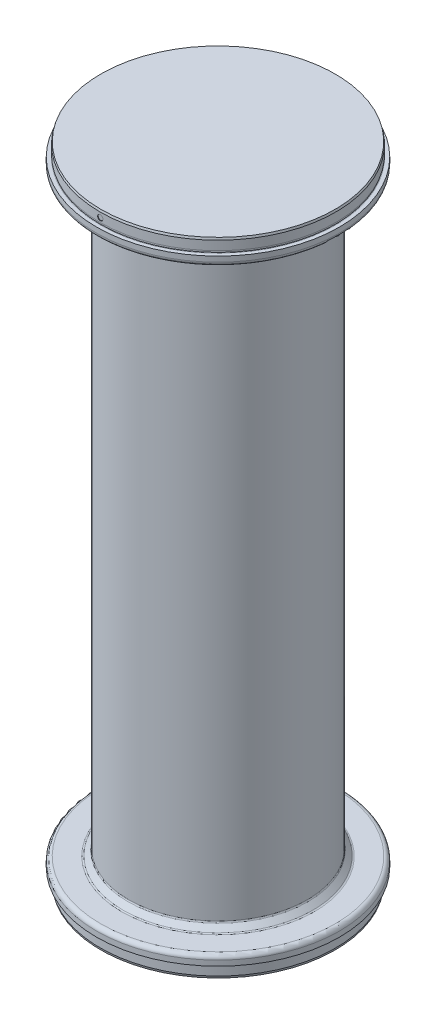
ISO-10303-21;
HEADER;
FILE_DESCRIPTION(('STEP AP214'),'2;1');
FILE_NAME('part.step','',(''),(''),'','','');
FILE_SCHEMA(('AUTOMOTIVE_DESIGN { 1 0 10303 214 1 1 1 1 }'));
ENDSEC;
DATA;
#1=APPLICATION_CONTEXT('core data for automotive mechanical design processes');
#2=APPLICATION_PROTOCOL_DEFINITION('international standard','automotive_design',2000,#1);
#3=PRODUCT_CONTEXT('',#1,'mechanical');
#4=PRODUCT('Part','Part','',(#3));
#5=PRODUCT_RELATED_PRODUCT_CATEGORY('part','',(#4));
#6=PRODUCT_DEFINITION_FORMATION('','',#4);
#7=PRODUCT_DEFINITION_CONTEXT('part definition',#1,'design');
#8=PRODUCT_DEFINITION('design','',#6,#7);
#9=PRODUCT_DEFINITION_SHAPE('','',#8);
#10=(LENGTH_UNIT() NAMED_UNIT(*) SI_UNIT(.MILLI.,.METRE.));
#11=(NAMED_UNIT(*) PLANE_ANGLE_UNIT() SI_UNIT($,.RADIAN.));
#12=(NAMED_UNIT(*) SI_UNIT($,.STERADIAN.) SOLID_ANGLE_UNIT());
#13=UNCERTAINTY_MEASURE_WITH_UNIT(LENGTH_MEASURE(1.E-05),#10,'distance_accuracy_value','');
#14=(GEOMETRIC_REPRESENTATION_CONTEXT(3) GLOBAL_UNCERTAINTY_ASSIGNED_CONTEXT((#13)) GLOBAL_UNIT_ASSIGNED_CONTEXT((#10,
#11,#12)) REPRESENTATION_CONTEXT('',''));
#15=CARTESIAN_POINT('',(0.,0.,0.));
#16=DIRECTION('',(0.,0.,1.));
#17=DIRECTION('',(1.,0.,0.));
#18=AXIS2_PLACEMENT_3D('',#15,#16,#17);
#19=CARTESIAN_POINT('',(0.,-299.2,0.));
#20=DIRECTION('',(0.,1.,0.));
#21=DIRECTION('',(0.,0.,1.));
#22=AXIS2_PLACEMENT_3D('',#19,#20,#21);
#23=TOROIDAL_SURFACE('',#22,56.,0.500000000000001);
#24=CARTESIAN_POINT('',(0.,-299.7,0.));
#25=DIRECTION('',(0.,-1.,0.));
#26=DIRECTION('',(0.,0.,-1.));
#27=AXIS2_PLACEMENT_3D('',#24,#25,#26);
#28=CIRCLE('',#27,56.);
#29=CARTESIAN_POINT('',(0.,-299.7,-56.));
#30=VERTEX_POINT('',#29);
#31=EDGE_CURVE('E399',#30,#30,#28,.T.);
#32=ORIENTED_EDGE('',*,*,#31,.F.);
#33=EDGE_LOOP('',(#32));
#34=FACE_BOUND('',#33,.T.);
#35=CARTESIAN_POINT('',(0.,-299.622141244461,0.));
#36=DIRECTION('',(0.,1.,0.));
#37=DIRECTION('',(0.,0.,1.));
#38=AXIS2_PLACEMENT_3D('',#35,#36,#37);
#39=CIRCLE('',#38,55.7320508075689);
#40=CARTESIAN_POINT('',(0.,-299.622141244461,55.7320508075688));
#41=VERTEX_POINT('',#40);
#42=EDGE_CURVE('E402',#41,#41,#39,.T.);
#43=ORIENTED_EDGE('',*,*,#42,.F.);
#44=EDGE_LOOP('',(#43));
#45=FACE_BOUND('',#44,.T.);
#46=ADVANCED_FACE('F37',(#34,#45),#23,.F.);
#47=CARTESIAN_POINT('',(0.,-5.8,0.));
#48=DIRECTION('',(0.,1.,0.));
#49=DIRECTION('',(0.,0.,1.));
#50=AXIS2_PLACEMENT_3D('',#47,#48,#49);
#51=TOROIDAL_SURFACE('',#50,56.,0.5);
#52=CARTESIAN_POINT('',(0.,-5.37785875553842,0.));
#53=DIRECTION('',(0.,1.,0.));
#54=DIRECTION('',(0.,0.,1.));
#55=AXIS2_PLACEMENT_3D('',#52,#53,#54);
#56=CIRCLE('',#55,55.732050807569);
#57=CARTESIAN_POINT('',(0.,-5.37785875553843,55.732050807569));
#58=VERTEX_POINT('',#57);
#59=EDGE_CURVE('E197',#58,#58,#56,.T.);
#60=ORIENTED_EDGE('',*,*,#59,.T.);
#61=EDGE_LOOP('',(#60));
#62=FACE_BOUND('',#61,.T.);
#63=CARTESIAN_POINT('',(0.,-5.30000000000003,0.));
#64=DIRECTION('',(0.,1.,0.));
#65=DIRECTION('',(0.,0.,1.));
#66=AXIS2_PLACEMENT_3D('',#63,#64,#65);
#67=CIRCLE('',#66,56.);
#68=CARTESIAN_POINT('',(0.,-5.30000000000003,56.));
#69=VERTEX_POINT('',#68);
#70=EDGE_CURVE('E101',#69,#69,#67,.T.);
#71=ORIENTED_EDGE('',*,*,#70,.F.);
#72=EDGE_LOOP('',(#71));
#73=FACE_BOUND('',#72,.T.);
#74=ADVANCED_FACE('F122',(#62,#73),#51,.F.);
#75=CARTESIAN_POINT('',(0.,-299.7,0.));
#76=DIRECTION('',(0.,1.,0.));
#77=DIRECTION('',(0.,0.,1.));
#78=AXIS2_PLACEMENT_3D('',#75,#76,#77);
#79=CYLINDRICAL_SURFACE('',#78,55.732050807569);
#80=CARTESIAN_POINT('',(0.,-6.22214124446158,0.));
#81=DIRECTION('',(0.,1.,0.));
#82=DIRECTION('',(0.,0.,1.));
#83=AXIS2_PLACEMENT_3D('',#80,#81,#82);
#84=CIRCLE('',#83,55.732050807569);
#85=CARTESIAN_POINT('',(0.,-6.22214124446158,55.732050807569));
#86=VERTEX_POINT('',#85);
#87=EDGE_CURVE('E189',#86,#86,#84,.T.);
#88=ORIENTED_EDGE('',*,*,#87,.T.);
#89=EDGE_LOOP('',(#88));
#90=FACE_BOUND('',#89,.T.);
#91=ORIENTED_EDGE('',*,*,#59,.F.);
#92=EDGE_LOOP('',(#91));
#93=FACE_BOUND('',#92,.T.);
#94=ADVANCED_FACE('F128',(#90,#93),#79,.T.);
#95=CARTESIAN_POINT('',(0.,-5.8,0.));
#96=DIRECTION('',(0.,1.,0.));
#97=DIRECTION('',(0.,0.,1.));
#98=AXIS2_PLACEMENT_3D('',#95,#96,#97);
#99=TOROIDAL_SURFACE('',#98,56.,0.5);
#100=CARTESIAN_POINT('',(0.,-6.29999999999997,0.));
#101=DIRECTION('',(0.,1.,0.));
#102=DIRECTION('',(0.,0.,1.));
#103=AXIS2_PLACEMENT_3D('',#100,#101,#102);
#104=CIRCLE('',#103,56.);
#105=CARTESIAN_POINT('',(0.,-6.29999999999998,56.));
#106=VERTEX_POINT('',#105);
#107=EDGE_CURVE('E185',#106,#106,#104,.T.);
#108=ORIENTED_EDGE('',*,*,#107,.T.);
#109=EDGE_LOOP('',(#108));
#110=FACE_BOUND('',#109,.T.);
#111=ORIENTED_EDGE('',*,*,#87,.F.);
#112=EDGE_LOOP('',(#111));
#113=FACE_BOUND('',#112,.T.);
#114=ADVANCED_FACE('F206',(#110,#113),#99,.F.);
#115=CARTESIAN_POINT('',(56.,-6.3,0.));
#116=DIRECTION('',(0.,1.,0.));
#117=DIRECTION('',(0.,0.,1.));
#118=AXIS2_PLACEMENT_3D('',#115,#116,#117);
#119=PLANE('',#118);
#120=CARTESIAN_POINT('',(0.,-6.30000000000003,0.));
#121=DIRECTION('',(0.,1.,0.));
#122=DIRECTION('',(0.,0.,1.));
#123=AXIS2_PLACEMENT_3D('',#120,#121,#122);
#124=CIRCLE('',#123,57.75);
#125=CARTESIAN_POINT('',(0.,-6.30000000000003,57.75));
#126=VERTEX_POINT('',#125);
#127=EDGE_CURVE('E183',#126,#126,#124,.T.);
#128=ORIENTED_EDGE('',*,*,#127,.T.);
#129=EDGE_LOOP('',(#128));
#130=FACE_BOUND('',#129,.T.);
#131=ORIENTED_EDGE('',*,*,#107,.F.);
#132=EDGE_LOOP('',(#131));
#133=FACE_BOUND('',#132,.T.);
#134=ADVANCED_FACE('F179',(#130,#133),#119,.T.);
#135=CARTESIAN_POINT('',(0.,-299.7,0.));
#136=DIRECTION('',(0.,1.,0.));
#137=DIRECTION('',(0.,0.,1.));
#138=AXIS2_PLACEMENT_3D('',#135,#136,#137);
#139=CYLINDRICAL_SURFACE('',#138,57.75);
#140=CARTESIAN_POINT('',(0.,-8.80000000000003,0.));
#141=DIRECTION('',(0.,-1.,0.));
#142=DIRECTION('',(0.,0.,-1.));
#143=AXIS2_PLACEMENT_3D('',#140,#141,#142);
#144=CIRCLE('',#143,57.75);
#145=CARTESIAN_POINT('',(0.,-8.80000000000002,-57.75));
#146=VERTEX_POINT('',#145);
#147=EDGE_CURVE('E52',#146,#146,#144,.F.);
#148=ORIENTED_EDGE('',*,*,#147,.T.);
#149=EDGE_LOOP('',(#148));
#150=FACE_BOUND('',#149,.T.);
#151=ORIENTED_EDGE('',*,*,#127,.F.);
#152=EDGE_LOOP('',(#151));
#153=FACE_BOUND('',#152,.T.);
#154=ADVANCED_FACE('F175',(#150,#153),#139,.T.);
#155=CARTESIAN_POINT('',(57.75,-10.8,0.));
#156=DIRECTION('',(0.,-1.,0.));
#157=DIRECTION('',(0.,0.,-1.));
#158=AXIS2_PLACEMENT_3D('',#155,#156,#157);
#159=PLANE('',#158);
#160=CARTESIAN_POINT('',(0.,-10.8,0.));
#161=DIRECTION('',(0.,-1.,0.));
#162=DIRECTION('',(0.,0.,-1.));
#163=AXIS2_PLACEMENT_3D('',#160,#161,#162);
#164=CIRCLE('',#163,55.75);
#165=CARTESIAN_POINT('',(0.,-10.8,-55.75));
#166=VERTEX_POINT('',#165);
#167=EDGE_CURVE('E48',#166,#166,#164,.T.);
#168=ORIENTED_EDGE('',*,*,#167,.T.);
#169=EDGE_LOOP('',(#168));
#170=FACE_BOUND('',#169,.T.);
#171=CARTESIAN_POINT('',(0.,-10.8,0.));
#172=DIRECTION('',(0.,-1.,0.));
#173=DIRECTION('',(0.,0.,-1.));
#174=AXIS2_PLACEMENT_3D('',#171,#172,#173);
#175=CIRCLE('',#174,45.8142135623732);
#176=CARTESIAN_POINT('',(0.,-10.8,-45.8142135623732));
#177=VERTEX_POINT('',#176);
#178=EDGE_CURVE('E78',#177,#177,#175,.F.);
#179=ORIENTED_EDGE('',*,*,#178,.T.);
#180=EDGE_LOOP('',(#179));
#181=FACE_BOUND('',#180,.T.);
#182=ADVANCED_FACE('F178',(#170,#181),#159,.T.);
#183=CARTESIAN_POINT('',(0.,-10.8,0.));
#184=DIRECTION('',(0.,1.,0.));
#185=DIRECTION('',(0.,0.,1.));
#186=AXIS2_PLACEMENT_3D('',#183,#184,#185);
#187=CONICAL_SURFACE('',#186,45.4000000000001,0.785398163397455);
#188=CARTESIAN_POINT('',(0.,-11.0928932188134,0.));
#189=DIRECTION('',(0.,1.,0.));
#190=DIRECTION('',(0.,0.,1.));
#191=AXIS2_PLACEMENT_3D('',#188,#189,#190);
#192=CIRCLE('',#191,45.1071067811867);
#193=CARTESIAN_POINT('',(0.,-11.0928932188135,45.1071067811867));
#194=VERTEX_POINT('',#193);
#195=EDGE_CURVE('E72',#194,#194,#192,.F.);
#196=ORIENTED_EDGE('',*,*,#195,.T.);
#197=EDGE_LOOP('',(#196));
#198=FACE_BOUND('',#197,.T.);
#199=CARTESIAN_POINT('',(0.,-13.4071067811866,0.));
#200=DIRECTION('',(0.,1.,0.));
#201=DIRECTION('',(0.,0.,1.));
#202=AXIS2_PLACEMENT_3D('',#199,#200,#201);
#203=CIRCLE('',#202,42.7928932188135);
#204=CARTESIAN_POINT('',(0.,-13.4071067811866,42.7928932188135));
#205=VERTEX_POINT('',#204);
#206=EDGE_CURVE('E75',#205,#205,#203,.T.);
#207=ORIENTED_EDGE('',*,*,#206,.T.);
#208=EDGE_LOOP('',(#207));
#209=FACE_BOUND('',#208,.T.);
#210=ADVANCED_FACE('F218',(#198,#209),#187,.T.);
#211=CARTESIAN_POINT('',(0.,-299.7,0.));
#212=DIRECTION('',(0.,1.,0.));
#213=DIRECTION('',(0.,0.,1.));
#214=AXIS2_PLACEMENT_3D('',#211,#212,#213);
#215=CYLINDRICAL_SURFACE('',#214,42.5);
#216=CARTESIAN_POINT('',(0.,-290.885786437627,0.));
#217=DIRECTION('',(0.,1.,0.));
#218=DIRECTION('',(0.,0.,1.));
#219=AXIS2_PLACEMENT_3D('',#216,#217,#218);
#220=CIRCLE('',#219,42.5);
#221=CARTESIAN_POINT('',(0.,-290.885786437627,42.5));
#222=VERTEX_POINT('',#221);
#223=EDGE_CURVE('E57',#222,#222,#220,.T.);
#224=ORIENTED_EDGE('',*,*,#223,.T.);
#225=EDGE_LOOP('',(#224));
#226=FACE_BOUND('',#225,.T.);
#227=CARTESIAN_POINT('',(0.,-14.1142135623732,0.));
#228=DIRECTION('',(0.,1.,0.));
#229=DIRECTION('',(0.,0.,1.));
#230=AXIS2_PLACEMENT_3D('',#227,#228,#229);
#231=CIRCLE('',#230,42.5);
#232=CARTESIAN_POINT('',(0.,-14.1142135623732,42.5));
#233=VERTEX_POINT('',#232);
#234=EDGE_CURVE('E60',#233,#233,#231,.F.);
#235=ORIENTED_EDGE('',*,*,#234,.T.);
#236=EDGE_LOOP('',(#235));
#237=FACE_BOUND('',#236,.T.);
#238=ADVANCED_FACE('F222',(#226,#237),#215,.T.);
#239=CARTESIAN_POINT('',(0.,-291.3,0.));
#240=DIRECTION('',(0.,-1.,0.));
#241=DIRECTION('',(0.,0.,-1.));
#242=AXIS2_PLACEMENT_3D('',#239,#240,#241);
#243=CONICAL_SURFACE('',#242,42.5,0.785398163397442);
#244=CARTESIAN_POINT('',(0.,-293.907106781187,0.));
#245=DIRECTION('',(0.,-1.,0.));
#246=DIRECTION('',(0.,0.,-1.));
#247=AXIS2_PLACEMENT_3D('',#244,#245,#246);
#248=CIRCLE('',#247,45.1071067811867);
#249=CARTESIAN_POINT('',(0.,-293.907106781187,-45.1071067811867));
#250=VERTEX_POINT('',#249);
#251=EDGE_CURVE('E66',#250,#250,#248,.F.);
#252=ORIENTED_EDGE('',*,*,#251,.T.);
#253=EDGE_LOOP('',(#252));
#254=FACE_BOUND('',#253,.T.);
#255=CARTESIAN_POINT('',(0.,-291.592893218813,0.));
#256=DIRECTION('',(0.,-1.,0.));
#257=DIRECTION('',(0.,0.,-1.));
#258=AXIS2_PLACEMENT_3D('',#255,#256,#257);
#259=CIRCLE('',#258,42.7928932188135);
#260=CARTESIAN_POINT('',(0.,-291.592893218813,-42.7928932188135));
#261=VERTEX_POINT('',#260);
#262=EDGE_CURVE('E69',#261,#261,#259,.T.);
#263=ORIENTED_EDGE('',*,*,#262,.T.);
#264=EDGE_LOOP('',(#263));
#265=FACE_BOUND('',#264,.T.);
#266=ADVANCED_FACE('F226',(#254,#265),#243,.T.);
#267=CARTESIAN_POINT('',(45.4000000000001,-294.2,0.));
#268=DIRECTION('',(0.,1.,0.));
#269=DIRECTION('',(0.,0.,1.));
#270=AXIS2_PLACEMENT_3D('',#267,#268,#269);
#271=PLANE('',#270);
#272=CARTESIAN_POINT('',(0.,-294.2,0.));
#273=DIRECTION('',(0.,1.,0.));
#274=DIRECTION('',(0.,0.,1.));
#275=AXIS2_PLACEMENT_3D('',#272,#273,#274);
#276=CIRCLE('',#275,55.75);
#277=CARTESIAN_POINT('',(0.,-294.2,55.75));
#278=VERTEX_POINT('',#277);
#279=EDGE_CURVE('E44',#278,#278,#276,.T.);
#280=ORIENTED_EDGE('',*,*,#279,.T.);
#281=EDGE_LOOP('',(#280));
#282=FACE_BOUND('',#281,.T.);
#283=CARTESIAN_POINT('',(0.,-294.2,0.));
#284=DIRECTION('',(0.,1.,0.));
#285=DIRECTION('',(0.,0.,1.));
#286=AXIS2_PLACEMENT_3D('',#283,#284,#285);
#287=CIRCLE('',#286,45.8142135623732);
#288=CARTESIAN_POINT('',(0.,-294.2,45.8142135623732));
#289=VERTEX_POINT('',#288);
#290=EDGE_CURVE('E63',#289,#289,#287,.F.);
#291=ORIENTED_EDGE('',*,*,#290,.T.);
#292=EDGE_LOOP('',(#291));
#293=FACE_BOUND('',#292,.T.);
#294=ADVANCED_FACE('F230',(#282,#293),#271,.T.);
#295=CARTESIAN_POINT('',(0.,-299.7,0.));
#296=DIRECTION('',(0.,1.,0.));
#297=DIRECTION('',(0.,0.,1.));
#298=AXIS2_PLACEMENT_3D('',#295,#296,#297);
#299=CYLINDRICAL_SURFACE('',#298,57.75);
#300=CARTESIAN_POINT('',(0.,-296.2,0.));
#301=DIRECTION('',(0.,1.,0.));
#302=DIRECTION('',(0.,0.,1.));
#303=AXIS2_PLACEMENT_3D('',#300,#301,#302);
#304=CIRCLE('',#303,57.75);
#305=CARTESIAN_POINT('',(0.,-296.2,57.75));
#306=VERTEX_POINT('',#305);
#307=EDGE_CURVE('E10',#306,#306,#304,.F.);
#308=ORIENTED_EDGE('',*,*,#307,.T.);
#309=EDGE_LOOP('',(#308));
#310=FACE_BOUND('',#309,.T.);
#311=CARTESIAN_POINT('',(0.,-298.7,0.));
#312=DIRECTION('',(0.,1.,0.));
#313=DIRECTION('',(0.,0.,1.));
#314=AXIS2_PLACEMENT_3D('',#311,#312,#313);
#315=CIRCLE('',#314,57.75);
#316=CARTESIAN_POINT('',(0.,-298.7,57.75));
#317=VERTEX_POINT('',#316);
#318=EDGE_CURVE('E186',#317,#317,#315,.T.);
#319=ORIENTED_EDGE('',*,*,#318,.T.);
#320=EDGE_LOOP('',(#319));
#321=FACE_BOUND('',#320,.T.);
#322=ADVANCED_FACE('F234',(#310,#321),#299,.T.);
#323=CARTESIAN_POINT('',(57.75,-298.7,0.));
#324=DIRECTION('',(0.,-1.,0.));
#325=DIRECTION('',(0.,0.,-1.));
#326=AXIS2_PLACEMENT_3D('',#323,#324,#325);
#327=PLANE('',#326);
#328=CARTESIAN_POINT('',(0.,-298.7,0.));
#329=DIRECTION('',(0.,1.,0.));
#330=DIRECTION('',(0.,0.,1.));
#331=AXIS2_PLACEMENT_3D('',#328,#329,#330);
#332=CIRCLE('',#331,56.0000000000001);
#333=CARTESIAN_POINT('',(0.,-298.7,56.));
#334=VERTEX_POINT('',#333);
#335=EDGE_CURVE('E192',#334,#334,#332,.T.);
#336=ORIENTED_EDGE('',*,*,#335,.T.);
#337=EDGE_LOOP('',(#336));
#338=FACE_BOUND('',#337,.T.);
#339=ORIENTED_EDGE('',*,*,#318,.F.);
#340=EDGE_LOOP('',(#339));
#341=FACE_BOUND('',#340,.T.);
#342=ADVANCED_FACE('F237',(#338,#341),#327,.T.);
#343=CARTESIAN_POINT('',(0.,-299.2,0.));
#344=DIRECTION('',(0.,1.,0.));
#345=DIRECTION('',(0.,0.,1.));
#346=AXIS2_PLACEMENT_3D('',#343,#344,#345);
#347=TOROIDAL_SURFACE('',#346,56.,0.500000000000008);
#348=CARTESIAN_POINT('',(0.,-298.777858755538,0.));
#349=DIRECTION('',(0.,1.,0.));
#350=DIRECTION('',(0.,0.,1.));
#351=AXIS2_PLACEMENT_3D('',#348,#349,#350);
#352=CIRCLE('',#351,55.732050807569);
#353=CARTESIAN_POINT('',(0.,-298.777858755538,55.732050807569));
#354=VERTEX_POINT('',#353);
#355=EDGE_CURVE('E407',#354,#354,#352,.T.);
#356=ORIENTED_EDGE('',*,*,#355,.T.);
#357=EDGE_LOOP('',(#356));
#358=FACE_BOUND('',#357,.T.);
#359=ORIENTED_EDGE('',*,*,#335,.F.);
#360=EDGE_LOOP('',(#359));
#361=FACE_BOUND('',#360,.T.);
#362=ADVANCED_FACE('F240',(#358,#361),#347,.F.);
#363=CARTESIAN_POINT('',(0.,-299.7,0.));
#364=DIRECTION('',(0.,1.,0.));
#365=DIRECTION('',(0.,0.,1.));
#366=AXIS2_PLACEMENT_3D('',#363,#364,#365);
#367=CYLINDRICAL_SURFACE('',#366,55.7320508075689);
#368=ORIENTED_EDGE('',*,*,#42,.T.);
#369=EDGE_LOOP('',(#368));
#370=FACE_BOUND('',#369,.T.);
#371=ORIENTED_EDGE('',*,*,#355,.F.);
#372=EDGE_LOOP('',(#371));
#373=FACE_BOUND('',#372,.T.);
#374=ADVANCED_FACE('F244',(#370,#373),#367,.T.);
#375=CARTESIAN_POINT('',(0.,-305.,0.));
#376=DIRECTION('',(0.,1.,0.));
#377=DIRECTION('',(0.,0.,1.));
#378=AXIS2_PLACEMENT_3D('',#375,#376,#377);
#379=CYLINDRICAL_SURFACE('',#378,56.);
#380=CARTESIAN_POINT('',(0.,-304.,0.));
#381=DIRECTION('',(0.,-1.,0.));
#382=DIRECTION('',(0.,0.,-1.));
#383=AXIS2_PLACEMENT_3D('',#380,#381,#382);
#384=CIRCLE('',#383,56.);
#385=CARTESIAN_POINT('',(0.,-304.,-56.));
#386=VERTEX_POINT('',#385);
#387=EDGE_CURVE('E81',#386,#386,#384,.F.);
#388=ORIENTED_EDGE('',*,*,#387,.T.);
#389=EDGE_LOOP('',(#388));
#390=FACE_BOUND('',#389,.T.);
#391=ORIENTED_EDGE('',*,*,#31,.T.);
#392=EDGE_LOOP('',(#391));
#393=FACE_BOUND('',#392,.T.);
#394=ADVANCED_FACE('F248',(#390,#393),#379,.T.);
#395=CARTESIAN_POINT('',(0.,-305.,0.));
#396=DIRECTION('',(0.,-1.,0.));
#397=DIRECTION('',(0.,0.,-1.));
#398=AXIS2_PLACEMENT_3D('',#395,#396,#397);
#399=PLANE('',#398);
#400=CARTESIAN_POINT('',(0.,-305.,0.));
#401=DIRECTION('',(0.,-1.,0.));
#402=DIRECTION('',(0.,0.,-1.));
#403=AXIS2_PLACEMENT_3D('',#400,#401,#402);
#404=CIRCLE('',#403,55.7320508075688);
#405=CARTESIAN_POINT('',(0.,-305.,-55.7320508075689));
#406=VERTEX_POINT('',#405);
#407=EDGE_CURVE('E84',#406,#406,#404,.T.);
#408=ORIENTED_EDGE('',*,*,#407,.T.);
#409=EDGE_LOOP('',(#408));
#410=FACE_BOUND('',#409,.T.);
#411=ADVANCED_FACE('F119',(#410),#399,.T.);
#412=CARTESIAN_POINT('',(0.,0.,0.));
#413=DIRECTION('',(0.,-1.,0.));
#414=DIRECTION('',(0.,0.,-1.));
#415=AXIS2_PLACEMENT_3D('',#412,#413,#414);
#416=CYLINDRICAL_SURFACE('',#415,56.);
#417=CARTESIAN_POINT('',(0.,-0.999999999999393,0.));
#418=DIRECTION('',(0.,1.,0.));
#419=DIRECTION('',(0.,0.,1.));
#420=AXIS2_PLACEMENT_3D('',#417,#418,#419);
#421=CIRCLE('',#420,56.);
#422=CARTESIAN_POINT('',(0.,-0.9999999999994,56.));
#423=VERTEX_POINT('',#422);
#424=EDGE_CURVE('E87',#423,#423,#421,.F.);
#425=ORIENTED_EDGE('',*,*,#424,.T.);
#426=EDGE_LOOP('',(#425));
#427=FACE_BOUND('',#426,.T.);
#428=CARTESIAN_POINT('',(1.24999999999999,-3.30000000000001,55.9860473689651));
#429=CARTESIAN_POINT('',(1.24999688963887,-3.37020366433376,55.9860475574269));
#430=CARTESIAN_POINT('',(1.24406588579105,-3.44045801035116,55.9861808349521));
#431=CARTESIAN_POINT('',(1.22048859883108,-3.57903121734381,55.9866996818331));
#432=CARTESIAN_POINT('',(1.20282827388892,-3.64734765600289,55.9870855535755));
#433=CARTESIAN_POINT('',(1.15629592179564,-3.78001745846903,55.9880658552625));
#434=CARTESIAN_POINT('',(1.12742932161818,-3.84437272314193,55.9886601842421));
#435=CARTESIAN_POINT('',(1.05931147341796,-3.9673057388356,55.9899903019052));
#436=CARTESIAN_POINT('',(1.02006278147823,-4.02588490707149,55.9907260557577));
#437=CARTESIAN_POINT('',(0.932279712771722,-4.13563959972913,55.9922563959625));
#438=CARTESIAN_POINT('',(0.88374292173312,-4.1868131931197,55.9930509975784));
#439=CARTESIAN_POINT('',(0.778765117208697,-4.28028804154015,55.9946093361605));
#440=CARTESIAN_POINT('',(0.722323791053312,-4.32258894543903,55.9953730719042));
#441=CARTESIAN_POINT('',(0.603134414103991,-4.39711871044454,55.9967836201851));
#442=CARTESIAN_POINT('',(0.540385823093325,-4.42934670783438,55.9974304226936));
#443=CARTESIAN_POINT('',(0.410367031989757,-4.48281007935621,55.9985340983977));
#444=CARTESIAN_POINT('',(0.343096845989343,-4.50404548774709,55.9989909721853));
#445=CARTESIAN_POINT('',(0.205956278116038,-4.53491754334805,55.9996632191393));
#446=CARTESIAN_POINT('',(0.136086332371211,-4.54455612704413,55.9998786326254));
#447=CARTESIAN_POINT('',(-0.00428019817757927,-4.55196688366278,56.0000438099505));
#448=CARTESIAN_POINT('',(-0.0747767810927266,-4.549739092341,55.9999935745898));
#449=CARTESIAN_POINT('',(-0.214382307614808,-4.53348200566256,55.9996331525608));
#450=CARTESIAN_POINT('',(-0.283491495872729,-4.51945481004637,55.9993230121433));
#451=CARTESIAN_POINT('',(-0.418373870629961,-4.48000033796205,55.9984777921935));
#452=CARTESIAN_POINT('',(-0.48414705149381,-4.45457304223663,55.9979427122812));
#453=CARTESIAN_POINT('',(-0.610497048247961,-4.39303775479692,55.9967078487871));
#454=CARTESIAN_POINT('',(-0.671073394985831,-4.3569288000851,55.9960080503563));
#455=CARTESIAN_POINT('',(-0.78530500569529,-4.27505593264041,55.9945226295033));
#456=CARTESIAN_POINT('',(-0.838960262158871,-4.22929200943396,55.993737006988));
#457=CARTESIAN_POINT('',(-0.937838865048235,-4.12939638302991,55.9921682885637));
#458=CARTESIAN_POINT('',(-0.983060368707748,-4.07526285579737,55.9913851932436));
#459=CARTESIAN_POINT('',(-1.06377359512674,-3.96017112892419,55.9899099891641));
#460=CARTESIAN_POINT('',(-1.09926531645143,-3.89921292827716,55.9892178804183));
#461=CARTESIAN_POINT('',(-1.15951127105516,-3.77220124361535,55.9880026973751));
#462=CARTESIAN_POINT('',(-1.18426544720393,-3.70614773249263,55.9874796239771));
#463=CARTESIAN_POINT('',(-1.22233244793757,-3.570820930815,55.9866615273536));
#464=CARTESIAN_POINT('',(-1.23564529000736,-3.5015476451808,55.9863665037795));
#465=CARTESIAN_POINT('',(-1.25044945994322,-3.36176375695762,55.9860378327075));
#466=CARTESIAN_POINT('',(-1.25194333888567,-3.29125342467348,55.9860041288047));
#467=CARTESIAN_POINT('',(-1.24307382183089,-3.15098293018022,55.9862017500441));
#468=CARTESIAN_POINT('',(-1.23271043319737,-3.08122276750525,55.9864330750216));
#469=CARTESIAN_POINT('',(-1.20042267482863,-2.94443998080837,55.987134624142));
#470=CARTESIAN_POINT('',(-1.17849946210575,-2.87741708353927,55.987604824376));
#471=CARTESIAN_POINT('',(-1.12371555868563,-2.74800300796554,55.988731095337));
#472=CARTESIAN_POINT('',(-1.09085485642531,-2.68561183455765,55.9893871662605));
#473=CARTESIAN_POINT('',(-1.01512220081122,-2.56722053127835,55.9908113539804));
#474=CARTESIAN_POINT('',(-0.972248528733056,-2.51122150107667,55.9915794900043));
#475=CARTESIAN_POINT('',(-0.877709492109729,-2.40721514266246,55.9931411433267));
#476=CARTESIAN_POINT('',(-0.826044113562378,-2.35920782717824,55.9939346606657));
#477=CARTESIAN_POINT('',(-0.715377352207859,-2.27253917459942,55.9954577828283));
#478=CARTESIAN_POINT('',(-0.65637468041118,-2.23387948318441,55.9961873763835));
#479=CARTESIAN_POINT('',(-0.532714843145242,-2.16701476561392,55.9975002408509));
#480=CARTESIAN_POINT('',(-0.468057687399902,-2.1388097214802,55.9980835120147));
#481=CARTESIAN_POINT('',(-0.334930489956477,-2.09365781051194,55.9990379241533));
#482=CARTESIAN_POINT('',(-0.266460811475537,-2.07670987320059,55.999409085298));
#483=CARTESIAN_POINT('',(-0.127646977541765,-2.05454974947422,55.999897515461));
#484=CARTESIAN_POINT('',(-0.0573028214891539,-2.04933756681434,56.000014784398));
#485=CARTESIAN_POINT('',(0.083246561885148,-2.05079705229693,55.9999822107917));
#486=CARTESIAN_POINT('',(0.153451816259794,-2.05746611797889,55.9998324267434));
#487=CARTESIAN_POINT('',(0.29174601720588,-2.08249345774404,55.9992827433743));
#488=CARTESIAN_POINT('',(0.359834959554001,-2.10085175515273,55.9988828435544));
#489=CARTESIAN_POINT('',(0.491965217638647,-2.14873626858925,55.9978779866512));
#490=CARTESIAN_POINT('',(0.556006461076081,-2.17826268403375,55.9972730259064));
#491=CARTESIAN_POINT('',(0.678221022273066,-2.24764382226418,55.9959262431638));
#492=CARTESIAN_POINT('',(0.736394560240623,-2.28749815725508,55.9951844263051));
#493=CARTESIAN_POINT('',(0.845232994749189,-2.37640931463093,55.9936474020458));
#494=CARTESIAN_POINT('',(0.895897044819055,-2.42546717302912,55.9928521886409));
#495=CARTESIAN_POINT('',(0.988283437599335,-2.53140656597392,55.9912978680228));
#496=CARTESIAN_POINT('',(1.03000355938619,-2.58829003800467,55.9905387698138));
#497=CARTESIAN_POINT('',(1.10332184556612,-2.70828266416014,55.9891420777498));
#498=CARTESIAN_POINT('',(1.13491420869797,-2.7713953594621,55.9885045536178));
#499=CARTESIAN_POINT('',(1.18701800565716,-2.90198130183895,55.9874242472492));
#500=CARTESIAN_POINT('',(1.2075426846034,-2.9694492280357,55.9869812323546));
#501=CARTESIAN_POINT('',(1.23147539161105,-3.08112086765232,55.9864586035693));
#502=CARTESIAN_POINT('',(1.23841341072616,-3.12459938855451,55.9863050580527));
#503=CARTESIAN_POINT('',(1.24767668897286,-3.21204530738187,55.9860993817168));
#504=CARTESIAN_POINT('',(1.25000194884943,-3.25601270522807,55.9860472508811));
#505=CARTESIAN_POINT('',(1.24999999999999,-3.30000000000001,55.9860473689651));
#506=B_SPLINE_CURVE_WITH_KNOTS('',3,(#428,#429,#430,#431,#432,#433,#434,#435,#436,#437,#438,
#439,#440,#441,#442,#443,#444,#445,#446,#447,#448,#449,#450,#451,#452,#453,#454,#455,#456,#457,
#458,#459,#460,#461,#462,#463,#464,#465,#466,#467,#468,#469,#470,#471,#472,#473,#474,#475,#476,
#477,#478,#479,#480,#481,#482,#483,#484,#485,#486,#487,#488,#489,#490,#491,#492,#493,#494,#495,
#496,#497,#498,#499,#500,#501,#502,#503,#504,#505),.UNSPECIFIED.,.T.,.F.,(4,2,2,2,2,2,2,2,2,2,2,
2,2,2,2,2,2,2,2,2,2,2,2,2,2,2,2,2,2,2,2,2,2,2,2,2,2,2,4),(0.,0.210450436251762,
0.421153269781356,0.631754191203126,0.842303310614905,1.05290723294897,1.2635194882266,
1.47414979782285,1.68477945097644,1.89537392743144,2.10596776932556,2.3165241433205,
2.527080872993,2.7376565910491,2.94823253753611,3.15885444088205,3.36947637528683,
3.58009943031443,3.79072216346236,4.00129943328702,4.21187657233709,4.42243263891137,
4.63298892808559,4.84358138580518,5.05417417892968,5.26480402064841,5.47543350015772,
5.68604294732055,5.89665246187317,6.10721585033339,6.31777965896764,6.52834722758315,
6.73890689090576,6.94949027054015,7.16012588105486,7.37088193063779,7.58138519750347,
7.71324650356471,7.84510778833015),.UNSPECIFIED.);
#507=CARTESIAN_POINT('',(1.24999999999999,-3.30000000000001,55.9860473689651));
#508=VERTEX_POINT('',#507);
#509=EDGE_CURVE('E93',#508,#508,#506,.T.);
#510=ORIENTED_EDGE('',*,*,#509,.T.);
#511=EDGE_LOOP('',(#510));
#512=FACE_BOUND('',#511,.T.);
#513=ORIENTED_EDGE('',*,*,#70,.T.);
#514=EDGE_LOOP('',(#513));
#515=FACE_BOUND('',#514,.T.);
#516=ADVANCED_FACE('F103',(#427,#512,#515),#416,.T.);
#517=CARTESIAN_POINT('',(0.,0.,0.));
#518=DIRECTION('',(0.,1.,0.));
#519=DIRECTION('',(0.,0.,1.));
#520=AXIS2_PLACEMENT_3D('',#517,#518,#519);
#521=PLANE('',#520);
#522=CARTESIAN_POINT('',(0.,0.,0.));
#523=DIRECTION('',(0.,1.,0.));
#524=DIRECTION('',(0.,0.,1.));
#525=AXIS2_PLACEMENT_3D('',#522,#523,#524);
#526=CIRCLE('',#525,55.732050807569);
#527=CARTESIAN_POINT('',(0.,0.,55.732050807569));
#528=VERTEX_POINT('',#527);
#529=EDGE_CURVE('E90',#528,#528,#526,.T.);
#530=ORIENTED_EDGE('',*,*,#529,.T.);
#531=EDGE_LOOP('',(#530));
#532=FACE_BOUND('',#531,.T.);
#533=ADVANCED_FACE('F112',(#532),#521,.T.);
#534=CARTESIAN_POINT('',(0.,-3.30000000000001,55.7180310780761));
#535=DIRECTION('',(0.,0.,1.));
#536=DIRECTION('',(1.,0.,0.));
#537=AXIS2_PLACEMENT_3D('',#534,#535,#536);
#538=CYLINDRICAL_SURFACE('',#537,1.24999999999999);
#539=CARTESIAN_POINT('',(0.,-3.30000000000001,55.7180310780761));
#540=DIRECTION('',(0.,0.,1.));
#541=DIRECTION('',(1.,0.,0.));
#542=AXIS2_PLACEMENT_3D('',#539,#540,#541);
#543=CIRCLE('',#542,1.24999999999999);
#544=CARTESIAN_POINT('',(1.24999999999999,-3.30000000000001,55.7180310780761));
#545=VERTEX_POINT('',#544);
#546=EDGE_CURVE('E398',#545,#545,#543,.T.);
#547=ORIENTED_EDGE('',*,*,#546,.F.);
#548=EDGE_LOOP('',(#547));
#549=FACE_BOUND('',#548,.T.);
#550=ORIENTED_EDGE('',*,*,#509,.F.);
#551=EDGE_LOOP('',(#550));
#552=FACE_BOUND('',#551,.T.);
#553=ADVANCED_FACE('F107',(#549,#552),#538,.F.);
#554=CARTESIAN_POINT('',(0.,-4.55,55.7180310780761));
#555=DIRECTION('',(0.,0.,-1.));
#556=DIRECTION('',(-1.,0.,0.));
#557=AXIS2_PLACEMENT_3D('',#554,#555,#556);
#558=PLANE('',#557);
#559=ORIENTED_EDGE('',*,*,#546,.T.);
#560=EDGE_LOOP('',(#559));
#561=FACE_BOUND('',#560,.T.);
#562=ADVANCED_FACE('F111',(#561),#558,.F.);
#563=CARTESIAN_POINT('',(0.,0.,0.));
#564=DIRECTION('',(0.,-1.,0.));
#565=DIRECTION('',(0.,0.,-1.));
#566=AXIS2_PLACEMENT_3D('',#563,#564,#565);
#567=CONICAL_SURFACE('',#566,55.732050807569,0.261799387799166);
#568=ORIENTED_EDGE('',*,*,#424,.F.);
#569=EDGE_LOOP('',(#568));
#570=FACE_BOUND('',#569,.T.);
#571=ORIENTED_EDGE('',*,*,#529,.F.);
#572=EDGE_LOOP('',(#571));
#573=FACE_BOUND('',#572,.T.);
#574=ADVANCED_FACE('F136',(#570,#573),#567,.T.);
#575=CARTESIAN_POINT('',(0.,-305.,0.));
#576=DIRECTION('',(0.,1.,0.));
#577=DIRECTION('',(0.,0.,1.));
#578=AXIS2_PLACEMENT_3D('',#575,#576,#577);
#579=CONICAL_SURFACE('',#578,55.7320508075688,0.261799387799168);
#580=ORIENTED_EDGE('',*,*,#387,.F.);
#581=EDGE_LOOP('',(#580));
#582=FACE_BOUND('',#581,.T.);
#583=ORIENTED_EDGE('',*,*,#407,.F.);
#584=EDGE_LOOP('',(#583));
#585=FACE_BOUND('',#584,.T.);
#586=ADVANCED_FACE('F142',(#582,#585),#579,.T.);
#587=CARTESIAN_POINT('',(0.,-11.8,0.));
#588=DIRECTION('',(0.,-1.,0.));
#589=DIRECTION('',(0.,0.,-1.));
#590=AXIS2_PLACEMENT_3D('',#587,#588,#589);
#591=TOROIDAL_SURFACE('',#590,45.8142135623732,1.);
#592=ORIENTED_EDGE('',*,*,#195,.F.);
#593=EDGE_LOOP('',(#592));
#594=FACE_BOUND('',#593,.T.);
#595=ORIENTED_EDGE('',*,*,#178,.F.);
#596=EDGE_LOOP('',(#595));
#597=FACE_BOUND('',#596,.T.);
#598=ADVANCED_FACE('F148',(#594,#597),#591,.F.);
#599=CARTESIAN_POINT('',(0.,-293.2,0.));
#600=DIRECTION('',(0.,1.,0.));
#601=DIRECTION('',(0.,0.,1.));
#602=AXIS2_PLACEMENT_3D('',#599,#600,#601);
#603=TOROIDAL_SURFACE('',#602,45.8142135623732,1.);
#604=ORIENTED_EDGE('',*,*,#290,.F.);
#605=EDGE_LOOP('',(#604));
#606=FACE_BOUND('',#605,.T.);
#607=ORIENTED_EDGE('',*,*,#251,.F.);
#608=EDGE_LOOP('',(#607));
#609=FACE_BOUND('',#608,.T.);
#610=ADVANCED_FACE('F152',(#606,#609),#603,.F.);
#611=CARTESIAN_POINT('',(0.,-290.885786437627,0.));
#612=DIRECTION('',(0.,1.,0.));
#613=DIRECTION('',(0.,0.,1.));
#614=AXIS2_PLACEMENT_3D('',#611,#612,#613);
#615=TOROIDAL_SURFACE('',#614,43.5,1.);
#616=ORIENTED_EDGE('',*,*,#262,.F.);
#617=EDGE_LOOP('',(#616));
#618=FACE_BOUND('',#617,.T.);
#619=ORIENTED_EDGE('',*,*,#223,.F.);
#620=EDGE_LOOP('',(#619));
#621=FACE_BOUND('',#620,.T.);
#622=ADVANCED_FACE('F156',(#618,#621),#615,.F.);
#623=CARTESIAN_POINT('',(0.,-14.1142135623732,0.));
#624=DIRECTION('',(0.,1.,0.));
#625=DIRECTION('',(0.,0.,1.));
#626=AXIS2_PLACEMENT_3D('',#623,#624,#625);
#627=TOROIDAL_SURFACE('',#626,43.5,1.);
#628=ORIENTED_EDGE('',*,*,#234,.F.);
#629=EDGE_LOOP('',(#628));
#630=FACE_BOUND('',#629,.T.);
#631=ORIENTED_EDGE('',*,*,#206,.F.);
#632=EDGE_LOOP('',(#631));
#633=FACE_BOUND('',#632,.T.);
#634=ADVANCED_FACE('F160',(#630,#633),#627,.F.);
#635=CARTESIAN_POINT('',(0.,-8.80000000000003,0.));
#636=DIRECTION('',(0.,-1.,0.));
#637=DIRECTION('',(0.,0.,-1.));
#638=AXIS2_PLACEMENT_3D('',#635,#636,#637);
#639=TOROIDAL_SURFACE('',#638,55.75,2.);
#640=ORIENTED_EDGE('',*,*,#167,.F.);
#641=EDGE_LOOP('',(#640));
#642=FACE_BOUND('',#641,.T.);
#643=ORIENTED_EDGE('',*,*,#147,.F.);
#644=EDGE_LOOP('',(#643));
#645=FACE_BOUND('',#644,.T.);
#646=ADVANCED_FACE('F163',(#642,#645),#639,.T.);
#647=CARTESIAN_POINT('',(0.,-296.2,0.));
#648=DIRECTION('',(0.,1.,0.));
#649=DIRECTION('',(0.,0.,1.));
#650=AXIS2_PLACEMENT_3D('',#647,#648,#649);
#651=TOROIDAL_SURFACE('',#650,55.75,2.);
#652=ORIENTED_EDGE('',*,*,#307,.F.);
#653=EDGE_LOOP('',(#652));
#654=FACE_BOUND('',#653,.T.);
#655=ORIENTED_EDGE('',*,*,#279,.F.);
#656=EDGE_LOOP('',(#655));
#657=FACE_BOUND('',#656,.T.);
#658=ADVANCED_FACE('F39',(#654,#657),#651,.T.);
#659=CLOSED_SHELL('',(#46,#74,#94,#114,#134,#154,#182,#210,#238,#266,#294,#322,#342,#362,#374,
#394,#411,#516,#533,#553,#562,#574,#586,#598,#610,#622,#634,#646,#658));
#660=MANIFOLD_SOLID_BREP('B2',#659);
#661=ADVANCED_BREP_SHAPE_REPRESENTATION('',(#18,#660),#14);
#662=SHAPE_DEFINITION_REPRESENTATION(#9,#661);
ENDSEC;
END-ISO-10303-21;
